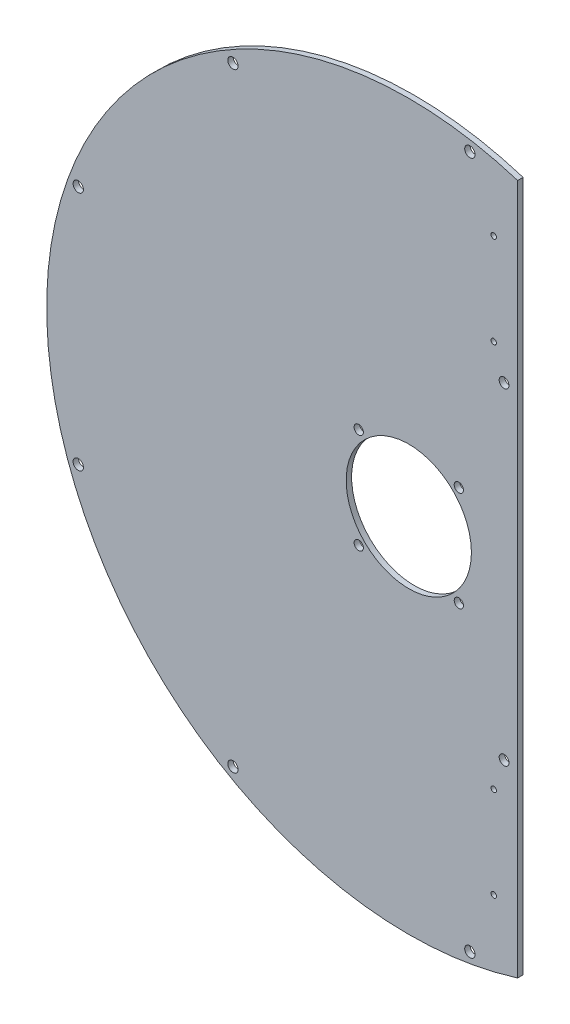
ISO-10303-21;
HEADER;
FILE_DESCRIPTION(('STEP AP214'),'2;1');
FILE_NAME('part.step','',(''),(''),'','','');
FILE_SCHEMA(('AUTOMOTIVE_DESIGN { 1 0 10303 214 1 1 1 1 }'));
ENDSEC;
DATA;
#1=APPLICATION_CONTEXT('core data for automotive mechanical design processes');
#2=APPLICATION_PROTOCOL_DEFINITION('international standard','automotive_design',2000,#1);
#3=PRODUCT_CONTEXT('',#1,'mechanical');
#4=PRODUCT('Part','Part','',(#3));
#5=PRODUCT_RELATED_PRODUCT_CATEGORY('part','',(#4));
#6=PRODUCT_DEFINITION_FORMATION('','',#4);
#7=PRODUCT_DEFINITION_CONTEXT('part definition',#1,'design');
#8=PRODUCT_DEFINITION('design','',#6,#7);
#9=PRODUCT_DEFINITION_SHAPE('','',#8);
#10=(LENGTH_UNIT() NAMED_UNIT(*) SI_UNIT(.MILLI.,.METRE.));
#11=(NAMED_UNIT(*) PLANE_ANGLE_UNIT() SI_UNIT($,.RADIAN.));
#12=(NAMED_UNIT(*) SI_UNIT($,.STERADIAN.) SOLID_ANGLE_UNIT());
#13=UNCERTAINTY_MEASURE_WITH_UNIT(LENGTH_MEASURE(1.E-05),#10,'distance_accuracy_value','');
#14=(GEOMETRIC_REPRESENTATION_CONTEXT(3) GLOBAL_UNCERTAINTY_ASSIGNED_CONTEXT((#13)) GLOBAL_UNIT_ASSIGNED_CONTEXT((#10,
#11,#12)) REPRESENTATION_CONTEXT('',''));
#15=CARTESIAN_POINT('',(0.,0.,0.));
#16=DIRECTION('',(0.,0.,1.));
#17=DIRECTION('',(1.,0.,0.));
#18=AXIS2_PLACEMENT_3D('',#15,#16,#17);
#19=CARTESIAN_POINT('',(0.,0.,5.));
#20=DIRECTION('',(0.,0.,1.));
#21=DIRECTION('',(1.,0.,0.));
#22=AXIS2_PLACEMENT_3D('',#19,#20,#21);
#23=PLANE('',#22);
#24=CARTESIAN_POINT('',(87.5,150.,5.));
#25=DIRECTION('',(0.,0.,1.));
#26=DIRECTION('',(1.,0.,0.));
#27=AXIS2_PLACEMENT_3D('',#24,#25,#26);
#28=CIRCLE('',#27,4.50000000000001);
#29=CARTESIAN_POINT('',(92.,150.,5.));
#30=VERTEX_POINT('',#29);
#31=EDGE_CURVE('E183',#30,#30,#28,.T.);
#32=ORIENTED_EDGE('',*,*,#31,.F.);
#33=EDGE_LOOP('',(#32));
#34=FACE_BOUND('',#33,.T.);
#35=CARTESIAN_POINT('',(87.5,-150.,5.));
#36=DIRECTION('',(0.,0.,1.));
#37=DIRECTION('',(1.,0.,0.));
#38=AXIS2_PLACEMENT_3D('',#35,#36,#37);
#39=CIRCLE('',#38,4.50000000000001);
#40=CARTESIAN_POINT('',(92.,-150.,5.));
#41=VERTEX_POINT('',#40);
#42=EDGE_CURVE('E177',#41,#41,#39,.T.);
#43=ORIENTED_EDGE('',*,*,#42,.F.);
#44=EDGE_LOOP('',(#43));
#45=FACE_BOUND('',#44,.T.);
#46=CARTESIAN_POINT('',(78.,-262.,5.));
#47=DIRECTION('',(0.,0.,1.));
#48=DIRECTION('',(1.,0.,0.));
#49=AXIS2_PLACEMENT_3D('',#46,#47,#48);
#50=CIRCLE('',#49,2.5);
#51=CARTESIAN_POINT('',(80.5,-262.,5.));
#52=VERTEX_POINT('',#51);
#53=EDGE_CURVE('E173',#52,#52,#50,.T.);
#54=ORIENTED_EDGE('',*,*,#53,.F.);
#55=EDGE_LOOP('',(#54));
#56=FACE_BOUND('',#55,.T.);
#57=CARTESIAN_POINT('',(78.,-178.,5.));
#58=DIRECTION('',(0.,0.,1.));
#59=DIRECTION('',(1.,0.,0.));
#60=AXIS2_PLACEMENT_3D('',#57,#58,#59);
#61=CIRCLE('',#60,2.5);
#62=CARTESIAN_POINT('',(80.5,-178.,5.));
#63=VERTEX_POINT('',#62);
#64=EDGE_CURVE('E167',#63,#63,#61,.T.);
#65=ORIENTED_EDGE('',*,*,#64,.F.);
#66=EDGE_LOOP('',(#65));
#67=FACE_BOUND('',#66,.T.);
#68=CARTESIAN_POINT('',(78.,178.,5.));
#69=DIRECTION('',(0.,0.,1.));
#70=DIRECTION('',(1.,0.,0.));
#71=AXIS2_PLACEMENT_3D('',#68,#69,#70);
#72=CIRCLE('',#71,2.5);
#73=CARTESIAN_POINT('',(80.5,178.,5.));
#74=VERTEX_POINT('',#73);
#75=EDGE_CURVE('E161',#74,#74,#72,.T.);
#76=ORIENTED_EDGE('',*,*,#75,.F.);
#77=EDGE_LOOP('',(#76));
#78=FACE_BOUND('',#77,.T.);
#79=CARTESIAN_POINT('',(78.,262.,5.));
#80=DIRECTION('',(0.,0.,1.));
#81=DIRECTION('',(1.,0.,0.));
#82=AXIS2_PLACEMENT_3D('',#79,#80,#81);
#83=CIRCLE('',#82,2.5);
#84=CARTESIAN_POINT('',(80.5,262.,5.));
#85=VERTEX_POINT('',#84);
#86=EDGE_CURVE('E155',#85,#85,#83,.T.);
#87=ORIENTED_EDGE('',*,*,#86,.F.);
#88=EDGE_LOOP('',(#87));
#89=FACE_BOUND('',#88,.T.);
#90=CARTESIAN_POINT('',(-45.9619407771258,-45.9619407771254,5.));
#91=DIRECTION('',(0.,0.,1.));
#92=DIRECTION('',(1.,0.,0.));
#93=AXIS2_PLACEMENT_3D('',#90,#91,#92);
#94=CIRCLE('',#93,4.25000000000001);
#95=CARTESIAN_POINT('',(-41.7119407771258,-45.9619407771254,5.));
#96=VERTEX_POINT('',#95);
#97=EDGE_CURVE('E147',#96,#96,#94,.T.);
#98=ORIENTED_EDGE('',*,*,#97,.F.);
#99=EDGE_LOOP('',(#98));
#100=FACE_BOUND('',#99,.T.);
#101=CARTESIAN_POINT('',(45.9619407771254,-45.9619407771258,5.));
#102=DIRECTION('',(0.,0.,1.));
#103=DIRECTION('',(1.,0.,0.));
#104=AXIS2_PLACEMENT_3D('',#101,#102,#103);
#105=CIRCLE('',#104,4.25000000000001);
#106=CARTESIAN_POINT('',(50.2119407771254,-45.9619407771258,5.));
#107=VERTEX_POINT('',#106);
#108=EDGE_CURVE('E141',#107,#107,#105,.T.);
#109=ORIENTED_EDGE('',*,*,#108,.F.);
#110=EDGE_LOOP('',(#109));
#111=FACE_BOUND('',#110,.T.);
#112=CARTESIAN_POINT('',(45.9619407771258,45.9619407771254,5.));
#113=DIRECTION('',(0.,0.,1.));
#114=DIRECTION('',(1.,0.,0.));
#115=AXIS2_PLACEMENT_3D('',#112,#113,#114);
#116=CIRCLE('',#115,4.25000000000001);
#117=CARTESIAN_POINT('',(50.2119407771258,45.9619407771254,5.));
#118=VERTEX_POINT('',#117);
#119=EDGE_CURVE('E133',#118,#118,#116,.T.);
#120=ORIENTED_EDGE('',*,*,#119,.F.);
#121=EDGE_LOOP('',(#120));
#122=FACE_BOUND('',#121,.T.);
#123=CARTESIAN_POINT('',(-45.9619407771254,45.9619407771258,5.));
#124=DIRECTION('',(0.,0.,1.));
#125=DIRECTION('',(1.,0.,0.));
#126=AXIS2_PLACEMENT_3D('',#123,#124,#125);
#127=CIRCLE('',#126,4.25000000000002);
#128=CARTESIAN_POINT('',(-41.7119407771253,45.9619407771258,5.));
#129=VERTEX_POINT('',#128);
#130=EDGE_CURVE('E127',#129,#129,#127,.T.);
#131=ORIENTED_EDGE('',*,*,#130,.F.);
#132=EDGE_LOOP('',(#131));
#133=FACE_BOUND('',#132,.T.);
#134=CARTESIAN_POINT('',(0.,0.,5.));
#135=DIRECTION('',(0.,0.,1.));
#136=DIRECTION('',(1.,0.,0.));
#137=AXIS2_PLACEMENT_3D('',#134,#135,#136);
#138=CIRCLE('',#137,57.5);
#139=CARTESIAN_POINT('',(57.5,0.,5.));
#140=VERTEX_POINT('',#139);
#141=EDGE_CURVE('E121',#140,#140,#138,.T.);
#142=ORIENTED_EDGE('',*,*,#141,.F.);
#143=EDGE_LOOP('',(#142));
#144=FACE_BOUND('',#143,.T.);
#145=CARTESIAN_POINT('',(-303.520716513848,110.472506294191,5.));
#146=DIRECTION('',(0.,0.,1.));
#147=DIRECTION('',(1.,0.,0.));
#148=AXIS2_PLACEMENT_3D('',#145,#146,#147);
#149=CIRCLE('',#148,4.74999999999998);
#150=CARTESIAN_POINT('',(-298.770716513849,110.472506294191,5.));
#151=VERTEX_POINT('',#150);
#152=EDGE_CURVE('E106',#151,#151,#149,.T.);
#153=ORIENTED_EDGE('',*,*,#152,.F.);
#154=EDGE_LOOP('',(#153));
#155=FACE_BOUND('',#154,.T.);
#156=CARTESIAN_POINT('',(-161.5,-279.726205422374,5.));
#157=DIRECTION('',(0.,0.,1.));
#158=DIRECTION('',(1.,0.,0.));
#159=AXIS2_PLACEMENT_3D('',#156,#157,#158);
#160=CIRCLE('',#159,4.75000000000001);
#161=CARTESIAN_POINT('',(-156.75,-279.726205422374,5.));
#162=VERTEX_POINT('',#161);
#163=EDGE_CURVE('E94',#162,#162,#160,.T.);
#164=ORIENTED_EDGE('',*,*,#163,.F.);
#165=EDGE_LOOP('',(#164));
#166=FACE_BOUND('',#165,.T.);
#167=CARTESIAN_POINT('',(56.0883613864186,318.092904222943,5.));
#168=DIRECTION('',(0.,0.,1.));
#169=DIRECTION('',(1.,0.,0.));
#170=AXIS2_PLACEMENT_3D('',#167,#168,#169);
#171=CIRCLE('',#170,4.75);
#172=CARTESIAN_POINT('',(60.8383613864186,318.092904222943,5.));
#173=VERTEX_POINT('',#172);
#174=EDGE_CURVE('E79',#173,#173,#171,.T.);
#175=ORIENTED_EDGE('',*,*,#174,.F.);
#176=EDGE_LOOP('',(#175));
#177=FACE_BOUND('',#176,.T.);
#178=CARTESIAN_POINT('',(0.,0.,5.));
#179=DIRECTION('',(0.,0.,1.));
#180=DIRECTION('',(1.,0.,0.));
#181=AXIS2_PLACEMENT_3D('',#178,#179,#180);
#182=CIRCLE('',#181,332.5);
#183=CARTESIAN_POINT('',(99.9999999999999,317.106054814474,5.));
#184=VERTEX_POINT('',#183);
#185=CARTESIAN_POINT('',(99.9999999999999,-317.106054814474,5.));
#186=VERTEX_POINT('',#185);
#187=EDGE_CURVE('E73',#184,#186,#182,.T.);
#188=ORIENTED_EDGE('',*,*,#187,.T.);
#189=DIRECTION('',(0.,1.,0.));
#190=VECTOR('',#189,1.);
#191=CARTESIAN_POINT('',(99.9999999999999,317.106054814474,5.));
#192=LINE('',#191,#190);
#193=EDGE_CURVE('E57',#186,#184,#192,.T.);
#194=ORIENTED_EDGE('',*,*,#193,.T.);
#195=EDGE_LOOP('',(#188,#194));
#196=FACE_BOUND('',#195,.T.);
#197=CARTESIAN_POINT('',(56.0883613864189,-318.092904222943,5.));
#198=DIRECTION('',(0.,0.,1.));
#199=DIRECTION('',(1.,0.,0.));
#200=AXIS2_PLACEMENT_3D('',#197,#198,#199);
#201=CIRCLE('',#200,4.75);
#202=CARTESIAN_POINT('',(60.8383613864189,-318.092904222943,5.));
#203=VERTEX_POINT('',#202);
#204=EDGE_CURVE('E89',#203,#203,#201,.T.);
#205=ORIENTED_EDGE('',*,*,#204,.F.);
#206=EDGE_LOOP('',(#205));
#207=FACE_BOUND('',#206,.T.);
#208=CARTESIAN_POINT('',(-303.520716513848,-110.472506294191,5.));
#209=DIRECTION('',(0.,0.,1.));
#210=DIRECTION('',(1.,0.,0.));
#211=AXIS2_PLACEMENT_3D('',#208,#209,#210);
#212=CIRCLE('',#211,4.74999999999998);
#213=CARTESIAN_POINT('',(-298.770716513848,-110.472506294191,5.));
#214=VERTEX_POINT('',#213);
#215=EDGE_CURVE('E100',#214,#214,#212,.T.);
#216=ORIENTED_EDGE('',*,*,#215,.F.);
#217=EDGE_LOOP('',(#216));
#218=FACE_BOUND('',#217,.T.);
#219=CARTESIAN_POINT('',(-161.5,279.726205422374,5.));
#220=DIRECTION('',(0.,0.,1.));
#221=DIRECTION('',(1.,0.,0.));
#222=AXIS2_PLACEMENT_3D('',#219,#220,#221);
#223=CIRCLE('',#222,4.75000000000001);
#224=CARTESIAN_POINT('',(-156.75,279.726205422374,5.));
#225=VERTEX_POINT('',#224);
#226=EDGE_CURVE('E112',#225,#225,#223,.T.);
#227=ORIENTED_EDGE('',*,*,#226,.F.);
#228=EDGE_LOOP('',(#227));
#229=FACE_BOUND('',#228,.T.);
#230=ADVANCED_FACE('F41',(#34,#45,#56,#67,#78,#89,#100,#111,#122,#133,#144,#155,#166,#177,#196,
#207,#218,#229),#23,.T.);
#231=CARTESIAN_POINT('',(0.,0.,0.));
#232=DIRECTION('',(0.,0.,1.));
#233=DIRECTION('',(1.,0.,0.));
#234=AXIS2_PLACEMENT_3D('',#231,#232,#233);
#235=PLANE('',#234);
#236=CARTESIAN_POINT('',(87.5,150.,0.));
#237=DIRECTION('',(0.,0.,1.));
#238=DIRECTION('',(1.,0.,0.));
#239=AXIS2_PLACEMENT_3D('',#236,#237,#238);
#240=CIRCLE('',#239,4.50000000000001);
#241=CARTESIAN_POINT('',(92.,150.,0.));
#242=VERTEX_POINT('',#241);
#243=EDGE_CURVE('E180',#242,#242,#240,.T.);
#244=ORIENTED_EDGE('',*,*,#243,.T.);
#245=EDGE_LOOP('',(#244));
#246=FACE_BOUND('',#245,.T.);
#247=CARTESIAN_POINT('',(87.5,-150.,0.));
#248=DIRECTION('',(0.,0.,1.));
#249=DIRECTION('',(1.,0.,0.));
#250=AXIS2_PLACEMENT_3D('',#247,#248,#249);
#251=CIRCLE('',#250,4.50000000000001);
#252=CARTESIAN_POINT('',(92.,-150.,0.));
#253=VERTEX_POINT('',#252);
#254=EDGE_CURVE('E176',#253,#253,#251,.T.);
#255=ORIENTED_EDGE('',*,*,#254,.T.);
#256=EDGE_LOOP('',(#255));
#257=FACE_BOUND('',#256,.T.);
#258=CARTESIAN_POINT('',(78.,-262.,0.));
#259=DIRECTION('',(0.,0.,1.));
#260=DIRECTION('',(1.,0.,0.));
#261=AXIS2_PLACEMENT_3D('',#258,#259,#260);
#262=CIRCLE('',#261,2.5);
#263=CARTESIAN_POINT('',(80.5,-262.,0.));
#264=VERTEX_POINT('',#263);
#265=EDGE_CURVE('E170',#264,#264,#262,.T.);
#266=ORIENTED_EDGE('',*,*,#265,.T.);
#267=EDGE_LOOP('',(#266));
#268=FACE_BOUND('',#267,.T.);
#269=CARTESIAN_POINT('',(78.,-178.,0.));
#270=DIRECTION('',(0.,0.,1.));
#271=DIRECTION('',(1.,0.,0.));
#272=AXIS2_PLACEMENT_3D('',#269,#270,#271);
#273=CIRCLE('',#272,2.5);
#274=CARTESIAN_POINT('',(80.5,-178.,0.));
#275=VERTEX_POINT('',#274);
#276=EDGE_CURVE('E164',#275,#275,#273,.T.);
#277=ORIENTED_EDGE('',*,*,#276,.T.);
#278=EDGE_LOOP('',(#277));
#279=FACE_BOUND('',#278,.T.);
#280=CARTESIAN_POINT('',(78.,178.,0.));
#281=DIRECTION('',(0.,0.,1.));
#282=DIRECTION('',(1.,0.,0.));
#283=AXIS2_PLACEMENT_3D('',#280,#281,#282);
#284=CIRCLE('',#283,2.5);
#285=CARTESIAN_POINT('',(80.5,178.,0.));
#286=VERTEX_POINT('',#285);
#287=EDGE_CURVE('E158',#286,#286,#284,.T.);
#288=ORIENTED_EDGE('',*,*,#287,.T.);
#289=EDGE_LOOP('',(#288));
#290=FACE_BOUND('',#289,.T.);
#291=CARTESIAN_POINT('',(78.,262.,0.));
#292=DIRECTION('',(0.,0.,1.));
#293=DIRECTION('',(1.,0.,0.));
#294=AXIS2_PLACEMENT_3D('',#291,#292,#293);
#295=CIRCLE('',#294,2.5);
#296=CARTESIAN_POINT('',(80.5,262.,0.));
#297=VERTEX_POINT('',#296);
#298=EDGE_CURVE('E150',#297,#297,#295,.T.);
#299=ORIENTED_EDGE('',*,*,#298,.T.);
#300=EDGE_LOOP('',(#299));
#301=FACE_BOUND('',#300,.T.);
#302=CARTESIAN_POINT('',(-45.9619407771258,-45.9619407771254,0.));
#303=DIRECTION('',(0.,0.,1.));
#304=DIRECTION('',(1.,0.,0.));
#305=AXIS2_PLACEMENT_3D('',#302,#303,#304);
#306=CIRCLE('',#305,4.25000000000001);
#307=CARTESIAN_POINT('',(-41.7119407771258,-45.9619407771254,0.));
#308=VERTEX_POINT('',#307);
#309=EDGE_CURVE('E144',#308,#308,#306,.T.);
#310=ORIENTED_EDGE('',*,*,#309,.T.);
#311=EDGE_LOOP('',(#310));
#312=FACE_BOUND('',#311,.T.);
#313=CARTESIAN_POINT('',(45.9619407771254,-45.9619407771258,0.));
#314=DIRECTION('',(0.,0.,1.));
#315=DIRECTION('',(1.,0.,0.));
#316=AXIS2_PLACEMENT_3D('',#313,#314,#315);
#317=CIRCLE('',#316,4.25000000000001);
#318=CARTESIAN_POINT('',(50.2119407771254,-45.9619407771258,0.));
#319=VERTEX_POINT('',#318);
#320=EDGE_CURVE('E137',#319,#319,#317,.T.);
#321=ORIENTED_EDGE('',*,*,#320,.T.);
#322=EDGE_LOOP('',(#321));
#323=FACE_BOUND('',#322,.T.);
#324=CARTESIAN_POINT('',(45.9619407771258,45.9619407771254,0.));
#325=DIRECTION('',(0.,0.,1.));
#326=DIRECTION('',(1.,0.,0.));
#327=AXIS2_PLACEMENT_3D('',#324,#325,#326);
#328=CIRCLE('',#327,4.25000000000001);
#329=CARTESIAN_POINT('',(50.2119407771258,45.9619407771254,0.));
#330=VERTEX_POINT('',#329);
#331=EDGE_CURVE('E130',#330,#330,#328,.T.);
#332=ORIENTED_EDGE('',*,*,#331,.T.);
#333=EDGE_LOOP('',(#332));
#334=FACE_BOUND('',#333,.T.);
#335=CARTESIAN_POINT('',(-45.9619407771254,45.9619407771258,0.));
#336=DIRECTION('',(0.,0.,1.));
#337=DIRECTION('',(1.,0.,0.));
#338=AXIS2_PLACEMENT_3D('',#335,#336,#337);
#339=CIRCLE('',#338,4.25000000000002);
#340=CARTESIAN_POINT('',(-41.7119407771253,45.9619407771258,0.));
#341=VERTEX_POINT('',#340);
#342=EDGE_CURVE('E124',#341,#341,#339,.T.);
#343=ORIENTED_EDGE('',*,*,#342,.T.);
#344=EDGE_LOOP('',(#343));
#345=FACE_BOUND('',#344,.T.);
#346=CARTESIAN_POINT('',(0.,0.,0.));
#347=DIRECTION('',(0.,0.,1.));
#348=DIRECTION('',(1.,0.,0.));
#349=AXIS2_PLACEMENT_3D('',#346,#347,#348);
#350=CIRCLE('',#349,57.5);
#351=CARTESIAN_POINT('',(57.5,0.,0.));
#352=VERTEX_POINT('',#351);
#353=EDGE_CURVE('E118',#352,#352,#350,.T.);
#354=ORIENTED_EDGE('',*,*,#353,.T.);
#355=EDGE_LOOP('',(#354));
#356=FACE_BOUND('',#355,.T.);
#357=CARTESIAN_POINT('',(0.,0.,0.));
#358=DIRECTION('',(0.,0.,1.));
#359=DIRECTION('',(1.,0.,0.));
#360=AXIS2_PLACEMENT_3D('',#357,#358,#359);
#361=CIRCLE('',#360,332.5);
#362=CARTESIAN_POINT('',(99.9999999999999,317.106054814474,0.));
#363=VERTEX_POINT('',#362);
#364=CARTESIAN_POINT('',(99.9999999999999,-317.106054814474,0.));
#365=VERTEX_POINT('',#364);
#366=EDGE_CURVE('E74',#363,#365,#361,.T.);
#367=ORIENTED_EDGE('',*,*,#366,.F.);
#368=DIRECTION('',(0.,1.,0.));
#369=VECTOR('',#368,1.);
#370=CARTESIAN_POINT('',(99.9999999999999,317.106054814474,0.));
#371=LINE('',#370,#369);
#372=EDGE_CURVE('E65',#365,#363,#371,.T.);
#373=ORIENTED_EDGE('',*,*,#372,.F.);
#374=EDGE_LOOP('',(#367,#373));
#375=FACE_BOUND('',#374,.T.);
#376=CARTESIAN_POINT('',(56.0883613864186,318.092904222943,0.));
#377=DIRECTION('',(0.,0.,1.));
#378=DIRECTION('',(1.,0.,0.));
#379=AXIS2_PLACEMENT_3D('',#376,#377,#378);
#380=CIRCLE('',#379,4.75);
#381=CARTESIAN_POINT('',(60.8383613864186,318.092904222943,0.));
#382=VERTEX_POINT('',#381);
#383=EDGE_CURVE('E82',#382,#382,#380,.T.);
#384=ORIENTED_EDGE('',*,*,#383,.T.);
#385=EDGE_LOOP('',(#384));
#386=FACE_BOUND('',#385,.T.);
#387=CARTESIAN_POINT('',(56.0883613864189,-318.092904222943,0.));
#388=DIRECTION('',(0.,0.,1.));
#389=DIRECTION('',(1.,0.,0.));
#390=AXIS2_PLACEMENT_3D('',#387,#388,#389);
#391=CIRCLE('',#390,4.75);
#392=CARTESIAN_POINT('',(60.8383613864189,-318.092904222943,0.));
#393=VERTEX_POINT('',#392);
#394=EDGE_CURVE('E91',#393,#393,#391,.T.);
#395=ORIENTED_EDGE('',*,*,#394,.T.);
#396=EDGE_LOOP('',(#395));
#397=FACE_BOUND('',#396,.T.);
#398=CARTESIAN_POINT('',(-161.5,-279.726205422374,0.));
#399=DIRECTION('',(0.,0.,1.));
#400=DIRECTION('',(1.,0.,0.));
#401=AXIS2_PLACEMENT_3D('',#398,#399,#400);
#402=CIRCLE('',#401,4.75000000000001);
#403=CARTESIAN_POINT('',(-156.75,-279.726205422374,0.));
#404=VERTEX_POINT('',#403);
#405=EDGE_CURVE('E97',#404,#404,#402,.T.);
#406=ORIENTED_EDGE('',*,*,#405,.T.);
#407=EDGE_LOOP('',(#406));
#408=FACE_BOUND('',#407,.T.);
#409=CARTESIAN_POINT('',(-303.520716513848,-110.472506294191,0.));
#410=DIRECTION('',(0.,0.,1.));
#411=DIRECTION('',(1.,0.,0.));
#412=AXIS2_PLACEMENT_3D('',#409,#410,#411);
#413=CIRCLE('',#412,4.74999999999998);
#414=CARTESIAN_POINT('',(-298.770716513848,-110.472506294191,0.));
#415=VERTEX_POINT('',#414);
#416=EDGE_CURVE('E103',#415,#415,#413,.T.);
#417=ORIENTED_EDGE('',*,*,#416,.T.);
#418=EDGE_LOOP('',(#417));
#419=FACE_BOUND('',#418,.T.);
#420=CARTESIAN_POINT('',(-303.520716513848,110.472506294191,0.));
#421=DIRECTION('',(0.,0.,1.));
#422=DIRECTION('',(1.,0.,0.));
#423=AXIS2_PLACEMENT_3D('',#420,#421,#422);
#424=CIRCLE('',#423,4.74999999999998);
#425=CARTESIAN_POINT('',(-298.770716513849,110.472506294191,0.));
#426=VERTEX_POINT('',#425);
#427=EDGE_CURVE('E109',#426,#426,#424,.T.);
#428=ORIENTED_EDGE('',*,*,#427,.T.);
#429=EDGE_LOOP('',(#428));
#430=FACE_BOUND('',#429,.T.);
#431=CARTESIAN_POINT('',(-161.5,279.726205422374,0.));
#432=DIRECTION('',(0.,0.,1.));
#433=DIRECTION('',(1.,0.,0.));
#434=AXIS2_PLACEMENT_3D('',#431,#432,#433);
#435=CIRCLE('',#434,4.75000000000001);
#436=CARTESIAN_POINT('',(-156.75,279.726205422374,0.));
#437=VERTEX_POINT('',#436);
#438=EDGE_CURVE('E115',#437,#437,#435,.T.);
#439=ORIENTED_EDGE('',*,*,#438,.T.);
#440=EDGE_LOOP('',(#439));
#441=FACE_BOUND('',#440,.T.);
#442=ADVANCED_FACE('F77',(#246,#257,#268,#279,#290,#301,#312,#323,#334,#345,#356,#375,#386,#397,
#408,#419,#430,#441),#235,.F.);
#443=CARTESIAN_POINT('',(0.,0.,5.));
#444=DIRECTION('',(0.,0.,-1.));
#445=DIRECTION('',(-1.,0.,0.));
#446=AXIS2_PLACEMENT_3D('',#443,#444,#445);
#447=CYLINDRICAL_SURFACE('',#446,332.5);
#448=ORIENTED_EDGE('',*,*,#366,.T.);
#449=DIRECTION('',(0.,0.,-1.));
#450=VECTOR('',#449,1.);
#451=CARTESIAN_POINT('',(99.9999999999999,-317.106054814474,5.));
#452=LINE('',#451,#450);
#453=EDGE_CURVE('E11',#186,#365,#452,.T.);
#454=ORIENTED_EDGE('',*,*,#453,.F.);
#455=ORIENTED_EDGE('',*,*,#187,.F.);
#456=DIRECTION('',(0.,0.,-1.));
#457=VECTOR('',#456,1.);
#458=CARTESIAN_POINT('',(99.9999999999999,317.106054814474,5.));
#459=LINE('',#458,#457);
#460=EDGE_CURVE('E50',#184,#363,#459,.T.);
#461=ORIENTED_EDGE('',*,*,#460,.T.);
#462=EDGE_LOOP('',(#448,#454,#455,#461));
#463=FACE_BOUND('',#462,.T.);
#464=ADVANCED_FACE('F43',(#463),#447,.T.);
#465=CARTESIAN_POINT('',(99.9999999999999,317.106054814474,5.));
#466=DIRECTION('',(-1.,0.,0.));
#467=DIRECTION('',(0.,0.,1.));
#468=AXIS2_PLACEMENT_3D('',#465,#466,#467);
#469=PLANE('',#468);
#470=ORIENTED_EDGE('',*,*,#372,.T.);
#471=ORIENTED_EDGE('',*,*,#460,.F.);
#472=ORIENTED_EDGE('',*,*,#193,.F.);
#473=ORIENTED_EDGE('',*,*,#453,.T.);
#474=EDGE_LOOP('',(#470,#471,#472,#473));
#475=FACE_BOUND('',#474,.T.);
#476=ADVANCED_FACE('F68',(#475),#469,.F.);
#477=CARTESIAN_POINT('',(56.0883613864186,318.092904222943,5.));
#478=DIRECTION('',(0.,0.,-1.));
#479=DIRECTION('',(-1.,0.,0.));
#480=AXIS2_PLACEMENT_3D('',#477,#478,#479);
#481=CYLINDRICAL_SURFACE('',#480,4.75);
#482=ORIENTED_EDGE('',*,*,#174,.T.);
#483=EDGE_LOOP('',(#482));
#484=FACE_BOUND('',#483,.T.);
#485=ORIENTED_EDGE('',*,*,#383,.F.);
#486=EDGE_LOOP('',(#485));
#487=FACE_BOUND('',#486,.T.);
#488=ADVANCED_FACE('F248',(#484,#487),#481,.F.);
#489=CARTESIAN_POINT('',(56.0883613864189,-318.092904222943,5.));
#490=DIRECTION('',(0.,0.,-1.));
#491=DIRECTION('',(-1.,0.,0.));
#492=AXIS2_PLACEMENT_3D('',#489,#490,#491);
#493=CYLINDRICAL_SURFACE('',#492,4.75);
#494=ORIENTED_EDGE('',*,*,#204,.T.);
#495=EDGE_LOOP('',(#494));
#496=FACE_BOUND('',#495,.T.);
#497=ORIENTED_EDGE('',*,*,#394,.F.);
#498=EDGE_LOOP('',(#497));
#499=FACE_BOUND('',#498,.T.);
#500=ADVANCED_FACE('F252',(#496,#499),#493,.F.);
#501=CARTESIAN_POINT('',(-161.5,-279.726205422374,5.));
#502=DIRECTION('',(0.,0.,-1.));
#503=DIRECTION('',(-1.,0.,0.));
#504=AXIS2_PLACEMENT_3D('',#501,#502,#503);
#505=CYLINDRICAL_SURFACE('',#504,4.75000000000001);
#506=ORIENTED_EDGE('',*,*,#163,.T.);
#507=EDGE_LOOP('',(#506));
#508=FACE_BOUND('',#507,.T.);
#509=ORIENTED_EDGE('',*,*,#405,.F.);
#510=EDGE_LOOP('',(#509));
#511=FACE_BOUND('',#510,.T.);
#512=ADVANCED_FACE('F257',(#508,#511),#505,.F.);
#513=CARTESIAN_POINT('',(-303.520716513848,-110.472506294191,5.));
#514=DIRECTION('',(0.,0.,-1.));
#515=DIRECTION('',(-1.,0.,0.));
#516=AXIS2_PLACEMENT_3D('',#513,#514,#515);
#517=CYLINDRICAL_SURFACE('',#516,4.74999999999998);
#518=ORIENTED_EDGE('',*,*,#215,.T.);
#519=EDGE_LOOP('',(#518));
#520=FACE_BOUND('',#519,.T.);
#521=ORIENTED_EDGE('',*,*,#416,.F.);
#522=EDGE_LOOP('',(#521));
#523=FACE_BOUND('',#522,.T.);
#524=ADVANCED_FACE('F264',(#520,#523),#517,.F.);
#525=CARTESIAN_POINT('',(-303.520716513848,110.472506294191,5.));
#526=DIRECTION('',(0.,0.,-1.));
#527=DIRECTION('',(-1.,0.,0.));
#528=AXIS2_PLACEMENT_3D('',#525,#526,#527);
#529=CYLINDRICAL_SURFACE('',#528,4.74999999999998);
#530=ORIENTED_EDGE('',*,*,#152,.T.);
#531=EDGE_LOOP('',(#530));
#532=FACE_BOUND('',#531,.T.);
#533=ORIENTED_EDGE('',*,*,#427,.F.);
#534=EDGE_LOOP('',(#533));
#535=FACE_BOUND('',#534,.T.);
#536=ADVANCED_FACE('F237',(#532,#535),#529,.F.);
#537=CARTESIAN_POINT('',(-161.5,279.726205422374,5.));
#538=DIRECTION('',(0.,0.,-1.));
#539=DIRECTION('',(-1.,0.,0.));
#540=AXIS2_PLACEMENT_3D('',#537,#538,#539);
#541=CYLINDRICAL_SURFACE('',#540,4.75000000000001);
#542=ORIENTED_EDGE('',*,*,#226,.T.);
#543=EDGE_LOOP('',(#542));
#544=FACE_BOUND('',#543,.T.);
#545=ORIENTED_EDGE('',*,*,#438,.F.);
#546=EDGE_LOOP('',(#545));
#547=FACE_BOUND('',#546,.T.);
#548=ADVANCED_FACE('F233',(#544,#547),#541,.F.);
#549=CARTESIAN_POINT('',(0.,0.,0.));
#550=DIRECTION('',(0.,0.,1.));
#551=DIRECTION('',(1.,0.,0.));
#552=AXIS2_PLACEMENT_3D('',#549,#550,#551);
#553=CYLINDRICAL_SURFACE('',#552,57.5);
#554=ORIENTED_EDGE('',*,*,#353,.F.);
#555=EDGE_LOOP('',(#554));
#556=FACE_BOUND('',#555,.T.);
#557=ORIENTED_EDGE('',*,*,#141,.T.);
#558=EDGE_LOOP('',(#557));
#559=FACE_BOUND('',#558,.T.);
#560=ADVANCED_FACE('F236',(#556,#559),#553,.F.);
#561=CARTESIAN_POINT('',(-45.9619407771254,45.9619407771258,0.));
#562=DIRECTION('',(0.,0.,1.));
#563=DIRECTION('',(1.,0.,0.));
#564=AXIS2_PLACEMENT_3D('',#561,#562,#563);
#565=CYLINDRICAL_SURFACE('',#564,4.25000000000002);
#566=ORIENTED_EDGE('',*,*,#342,.F.);
#567=EDGE_LOOP('',(#566));
#568=FACE_BOUND('',#567,.T.);
#569=ORIENTED_EDGE('',*,*,#130,.T.);
#570=EDGE_LOOP('',(#569));
#571=FACE_BOUND('',#570,.T.);
#572=ADVANCED_FACE('F274',(#568,#571),#565,.F.);
#573=CARTESIAN_POINT('',(45.9619407771258,45.9619407771254,0.));
#574=DIRECTION('',(0.,0.,1.));
#575=DIRECTION('',(1.,0.,0.));
#576=AXIS2_PLACEMENT_3D('',#573,#574,#575);
#577=CYLINDRICAL_SURFACE('',#576,4.25000000000001);
#578=ORIENTED_EDGE('',*,*,#331,.F.);
#579=EDGE_LOOP('',(#578));
#580=FACE_BOUND('',#579,.T.);
#581=ORIENTED_EDGE('',*,*,#119,.T.);
#582=EDGE_LOOP('',(#581));
#583=FACE_BOUND('',#582,.T.);
#584=ADVANCED_FACE('F278',(#580,#583),#577,.F.);
#585=CARTESIAN_POINT('',(45.9619407771254,-45.9619407771258,0.));
#586=DIRECTION('',(0.,0.,1.));
#587=DIRECTION('',(1.,0.,0.));
#588=AXIS2_PLACEMENT_3D('',#585,#586,#587);
#589=CYLINDRICAL_SURFACE('',#588,4.25000000000001);
#590=ORIENTED_EDGE('',*,*,#320,.F.);
#591=EDGE_LOOP('',(#590));
#592=FACE_BOUND('',#591,.T.);
#593=ORIENTED_EDGE('',*,*,#108,.T.);
#594=EDGE_LOOP('',(#593));
#595=FACE_BOUND('',#594,.T.);
#596=ADVANCED_FACE('F282',(#592,#595),#589,.F.);
#597=CARTESIAN_POINT('',(-45.9619407771258,-45.9619407771254,0.));
#598=DIRECTION('',(0.,0.,1.));
#599=DIRECTION('',(1.,0.,0.));
#600=AXIS2_PLACEMENT_3D('',#597,#598,#599);
#601=CYLINDRICAL_SURFACE('',#600,4.25000000000001);
#602=ORIENTED_EDGE('',*,*,#309,.F.);
#603=EDGE_LOOP('',(#602));
#604=FACE_BOUND('',#603,.T.);
#605=ORIENTED_EDGE('',*,*,#97,.T.);
#606=EDGE_LOOP('',(#605));
#607=FACE_BOUND('',#606,.T.);
#608=ADVANCED_FACE('F286',(#604,#607),#601,.F.);
#609=CARTESIAN_POINT('',(78.,262.,5.));
#610=DIRECTION('',(0.,0.,1.));
#611=DIRECTION('',(1.,0.,0.));
#612=AXIS2_PLACEMENT_3D('',#609,#610,#611);
#613=CYLINDRICAL_SURFACE('',#612,2.5);
#614=ORIENTED_EDGE('',*,*,#298,.F.);
#615=EDGE_LOOP('',(#614));
#616=FACE_BOUND('',#615,.T.);
#617=ORIENTED_EDGE('',*,*,#86,.T.);
#618=EDGE_LOOP('',(#617));
#619=FACE_BOUND('',#618,.T.);
#620=ADVANCED_FACE('F290',(#616,#619),#613,.F.);
#621=CARTESIAN_POINT('',(78.,178.,5.));
#622=DIRECTION('',(0.,0.,1.));
#623=DIRECTION('',(1.,0.,0.));
#624=AXIS2_PLACEMENT_3D('',#621,#622,#623);
#625=CYLINDRICAL_SURFACE('',#624,2.5);
#626=ORIENTED_EDGE('',*,*,#287,.F.);
#627=EDGE_LOOP('',(#626));
#628=FACE_BOUND('',#627,.T.);
#629=ORIENTED_EDGE('',*,*,#75,.T.);
#630=EDGE_LOOP('',(#629));
#631=FACE_BOUND('',#630,.T.);
#632=ADVANCED_FACE('F294',(#628,#631),#625,.F.);
#633=CARTESIAN_POINT('',(78.,-178.,5.));
#634=DIRECTION('',(0.,0.,1.));
#635=DIRECTION('',(1.,0.,0.));
#636=AXIS2_PLACEMENT_3D('',#633,#634,#635);
#637=CYLINDRICAL_SURFACE('',#636,2.5);
#638=ORIENTED_EDGE('',*,*,#276,.F.);
#639=EDGE_LOOP('',(#638));
#640=FACE_BOUND('',#639,.T.);
#641=ORIENTED_EDGE('',*,*,#64,.T.);
#642=EDGE_LOOP('',(#641));
#643=FACE_BOUND('',#642,.T.);
#644=ADVANCED_FACE('F298',(#640,#643),#637,.F.);
#645=CARTESIAN_POINT('',(78.,-262.,5.));
#646=DIRECTION('',(0.,0.,1.));
#647=DIRECTION('',(1.,0.,0.));
#648=AXIS2_PLACEMENT_3D('',#645,#646,#647);
#649=CYLINDRICAL_SURFACE('',#648,2.5);
#650=ORIENTED_EDGE('',*,*,#265,.F.);
#651=EDGE_LOOP('',(#650));
#652=FACE_BOUND('',#651,.T.);
#653=ORIENTED_EDGE('',*,*,#53,.T.);
#654=EDGE_LOOP('',(#653));
#655=FACE_BOUND('',#654,.T.);
#656=ADVANCED_FACE('F302',(#652,#655),#649,.F.);
#657=CARTESIAN_POINT('',(87.5,-150.,0.));
#658=DIRECTION('',(0.,0.,1.));
#659=DIRECTION('',(1.,0.,0.));
#660=AXIS2_PLACEMENT_3D('',#657,#658,#659);
#661=CYLINDRICAL_SURFACE('',#660,4.50000000000001);
#662=ORIENTED_EDGE('',*,*,#254,.F.);
#663=EDGE_LOOP('',(#662));
#664=FACE_BOUND('',#663,.T.);
#665=ORIENTED_EDGE('',*,*,#42,.T.);
#666=EDGE_LOOP('',(#665));
#667=FACE_BOUND('',#666,.T.);
#668=ADVANCED_FACE('F194',(#664,#667),#661,.F.);
#669=CARTESIAN_POINT('',(87.5,150.,0.));
#670=DIRECTION('',(0.,0.,1.));
#671=DIRECTION('',(1.,0.,0.));
#672=AXIS2_PLACEMENT_3D('',#669,#670,#671);
#673=CYLINDRICAL_SURFACE('',#672,4.50000000000001);
#674=ORIENTED_EDGE('',*,*,#243,.F.);
#675=EDGE_LOOP('',(#674));
#676=FACE_BOUND('',#675,.T.);
#677=ORIENTED_EDGE('',*,*,#31,.T.);
#678=EDGE_LOOP('',(#677));
#679=FACE_BOUND('',#678,.T.);
#680=ADVANCED_FACE('F191',(#676,#679),#673,.F.);
#681=CLOSED_SHELL('',(#230,#442,#464,#476,#488,#500,#512,#524,#536,#548,#560,#572,#584,#596,
#608,#620,#632,#644,#656,#668,#680));
#682=MANIFOLD_SOLID_BREP('B2',#681);
#683=ADVANCED_BREP_SHAPE_REPRESENTATION('',(#18,#682),#14);
#684=SHAPE_DEFINITION_REPRESENTATION(#9,#683);
ENDSEC;
END-ISO-10303-21;
